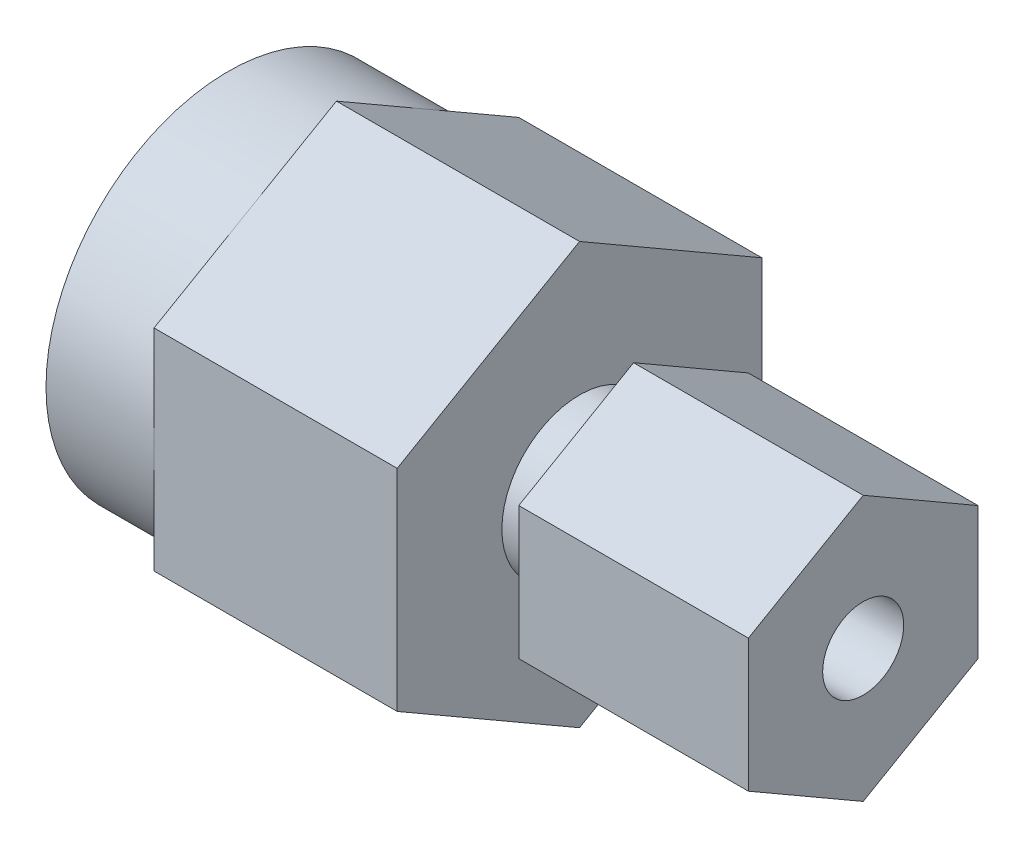
ISO-10303-21;
HEADER;
FILE_DESCRIPTION(('STEP AP214'),'2;1');
FILE_NAME('part.step','',(''),(''),'','','');
FILE_SCHEMA(('AUTOMOTIVE_DESIGN { 1 0 10303 214 1 1 1 1 }'));
ENDSEC;
DATA;
#1=APPLICATION_CONTEXT('core data for automotive mechanical design processes');
#2=APPLICATION_PROTOCOL_DEFINITION('international standard','automotive_design',2000,#1);
#3=PRODUCT_CONTEXT('',#1,'mechanical');
#4=PRODUCT('Part','Part','',(#3));
#5=PRODUCT_RELATED_PRODUCT_CATEGORY('part','',(#4));
#6=PRODUCT_DEFINITION_FORMATION('','',#4);
#7=PRODUCT_DEFINITION_CONTEXT('part definition',#1,'design');
#8=PRODUCT_DEFINITION('design','',#6,#7);
#9=PRODUCT_DEFINITION_SHAPE('','',#8);
#10=(LENGTH_UNIT() NAMED_UNIT(*) SI_UNIT(.MILLI.,.METRE.));
#11=(NAMED_UNIT(*) PLANE_ANGLE_UNIT() SI_UNIT($,.RADIAN.));
#12=(NAMED_UNIT(*) SI_UNIT($,.STERADIAN.) SOLID_ANGLE_UNIT());
#13=UNCERTAINTY_MEASURE_WITH_UNIT(LENGTH_MEASURE(1.E-05),#10,'distance_accuracy_value','');
#14=(GEOMETRIC_REPRESENTATION_CONTEXT(3) GLOBAL_UNCERTAINTY_ASSIGNED_CONTEXT((#13)) GLOBAL_UNIT_ASSIGNED_CONTEXT((#10,
#11,#12)) REPRESENTATION_CONTEXT('',''));
#15=CARTESIAN_POINT('',(0.,0.,0.));
#16=DIRECTION('',(0.,0.,1.));
#17=DIRECTION('',(1.,0.,0.));
#18=AXIS2_PLACEMENT_3D('',#15,#16,#17);
#19=CARTESIAN_POINT('',(0.,0.,0.));
#20=DIRECTION('',(-1.,0.,0.));
#21=DIRECTION('',(0.,0.,1.));
#22=AXIS2_PLACEMENT_3D('',#19,#20,#21);
#23=CYLINDRICAL_SURFACE('',#22,13.5);
#24=CARTESIAN_POINT('',(0.,0.,0.));
#25=DIRECTION('',(-1.,0.,0.));
#26=DIRECTION('',(0.,0.,1.));
#27=AXIS2_PLACEMENT_3D('',#24,#25,#26);
#28=CIRCLE('',#27,13.5);
#29=CARTESIAN_POINT('',(0.,0.,13.5));
#30=VERTEX_POINT('',#29);
#31=EDGE_CURVE('E335',#30,#30,#28,.T.);
#32=ORIENTED_EDGE('',*,*,#31,.F.);
#33=EDGE_LOOP('',(#32));
#34=FACE_BOUND('',#33,.T.);
#35=CARTESIAN_POINT('',(8.,0.,0.));
#36=DIRECTION('',(1.,0.,0.));
#37=DIRECTION('',(0.,0.,-1.));
#38=AXIS2_PLACEMENT_3D('',#35,#36,#37);
#39=CIRCLE('',#38,13.5);
#40=CARTESIAN_POINT('',(8.,0.,-13.5));
#41=VERTEX_POINT('',#40);
#42=CARTESIAN_POINT('',(8.,11.6913429510899,-6.75));
#43=VERTEX_POINT('',#42);
#44=EDGE_CURVE('E11',#41,#43,#39,.T.);
#45=ORIENTED_EDGE('',*,*,#44,.F.);
#46=CARTESIAN_POINT('',(8.,-11.6913429510899,-6.75));
#47=VERTEX_POINT('',#46);
#48=EDGE_CURVE('E49',#47,#41,#39,.T.);
#49=ORIENTED_EDGE('',*,*,#48,.F.);
#50=CARTESIAN_POINT('',(8.,-11.6913429510899,6.75));
#51=VERTEX_POINT('',#50);
#52=EDGE_CURVE('E345',#51,#47,#39,.T.);
#53=ORIENTED_EDGE('',*,*,#52,.F.);
#54=CARTESIAN_POINT('',(8.,0.,13.5));
#55=VERTEX_POINT('',#54);
#56=EDGE_CURVE('E352',#55,#51,#39,.T.);
#57=ORIENTED_EDGE('',*,*,#56,.F.);
#58=CARTESIAN_POINT('',(8.,11.6913429510899,6.75));
#59=VERTEX_POINT('',#58);
#60=EDGE_CURVE('E65',#59,#55,#39,.T.);
#61=ORIENTED_EDGE('',*,*,#60,.F.);
#62=EDGE_CURVE('E55',#43,#59,#39,.T.);
#63=ORIENTED_EDGE('',*,*,#62,.F.);
#64=EDGE_LOOP('',(#45,#49,#53,#57,#61,#63));
#65=FACE_BOUND('',#64,.T.);
#66=ADVANCED_FACE('F45',(#34,#65),#23,.T.);
#67=CARTESIAN_POINT('',(30.,5.75,0.));
#68=DIRECTION('',(1.,0.,0.));
#69=DIRECTION('',(0.,0.,-1.));
#70=AXIS2_PLACEMENT_3D('',#67,#68,#69);
#71=PLANE('',#70);
#72=CARTESIAN_POINT('',(30.,0.,0.));
#73=DIRECTION('',(-1.,0.,0.));
#74=DIRECTION('',(0.,0.,1.));
#75=AXIS2_PLACEMENT_3D('',#72,#73,#74);
#76=CIRCLE('',#75,5.75);
#77=CARTESIAN_POINT('',(30.,0.,5.75));
#78=VERTEX_POINT('',#77);
#79=EDGE_CURVE('E327',#78,#78,#76,.T.);
#80=ORIENTED_EDGE('',*,*,#79,.F.);
#81=EDGE_LOOP('',(#80));
#82=FACE_BOUND('',#81,.T.);
#83=DIRECTION('',(0.,0.5,0.866025403784439));
#84=VECTOR('',#83,1.);
#85=CARTESIAN_POINT('',(30.,8.79871593216773,-1.76017696411974));
#86=LINE('',#85,#84);
#87=CARTESIAN_POINT('',(30.,4.90747728811182,-8.5));
#88=VERTEX_POINT('',#87);
#89=CARTESIAN_POINT('',(30.,9.81495457622364,0.));
#90=VERTEX_POINT('',#89);
#91=EDGE_CURVE('E295',#88,#90,#86,.T.);
#92=ORIENTED_EDGE('',*,*,#91,.F.);
#93=DIRECTION('',(0.,1.,0.));
#94=VECTOR('',#93,1.);
#95=CARTESIAN_POINT('',(30.,5.75,-8.5));
#96=LINE('',#95,#94);
#97=CARTESIAN_POINT('',(30.,-4.90747728811182,-8.5));
#98=VERTEX_POINT('',#97);
#99=EDGE_CURVE('E292',#98,#88,#96,.T.);
#100=ORIENTED_EDGE('',*,*,#99,.F.);
#101=DIRECTION('',(0.,0.5,-0.866025403784439));
#102=VECTOR('',#101,1.);
#103=CARTESIAN_POINT('',(30.,-5.92371593216773,-6.73982303588026));
#104=LINE('',#103,#102);
#105=CARTESIAN_POINT('',(30.,-9.81495457622364,0.));
#106=VERTEX_POINT('',#105);
#107=EDGE_CURVE('E289',#106,#98,#104,.T.);
#108=ORIENTED_EDGE('',*,*,#107,.F.);
#109=DIRECTION('',(0.,-0.5,-0.866025403784439));
#110=VECTOR('',#109,1.);
#111=CARTESIAN_POINT('',(30.,-5.92371593216773,6.73982303588027));
#112=LINE('',#111,#110);
#113=CARTESIAN_POINT('',(30.,-4.90747728811182,8.5));
#114=VERTEX_POINT('',#113);
#115=EDGE_CURVE('E286',#114,#106,#112,.T.);
#116=ORIENTED_EDGE('',*,*,#115,.F.);
#117=DIRECTION('',(0.,-1.,0.));
#118=VECTOR('',#117,1.);
#119=CARTESIAN_POINT('',(30.,5.75,8.5));
#120=LINE('',#119,#118);
#121=CARTESIAN_POINT('',(30.,4.90747728811182,8.5));
#122=VERTEX_POINT('',#121);
#123=EDGE_CURVE('E283',#122,#114,#120,.T.);
#124=ORIENTED_EDGE('',*,*,#123,.F.);
#125=DIRECTION('',(0.,-0.5,0.866025403784439));
#126=VECTOR('',#125,1.);
#127=CARTESIAN_POINT('',(30.,8.79871593216773,1.76017696411974));
#128=LINE('',#127,#126);
#129=EDGE_CURVE('E265',#90,#122,#128,.T.);
#130=ORIENTED_EDGE('',*,*,#129,.F.);
#131=EDGE_LOOP('',(#92,#100,#108,#116,#124,#130));
#132=FACE_BOUND('',#131,.T.);
#133=ADVANCED_FACE('F381',(#82,#132),#71,.F.);
#134=CARTESIAN_POINT('',(47.,10.,0.));
#135=DIRECTION('',(-1.,0.,0.));
#136=DIRECTION('',(0.,0.,1.));
#137=AXIS2_PLACEMENT_3D('',#134,#135,#136);
#138=PLANE('',#137);
#139=CARTESIAN_POINT('',(47.,0.,0.));
#140=DIRECTION('',(-1.,0.,0.));
#141=DIRECTION('',(0.,0.,1.));
#142=AXIS2_PLACEMENT_3D('',#139,#140,#141);
#143=CIRCLE('',#142,3.);
#144=CARTESIAN_POINT('',(47.,0.,3.));
#145=VERTEX_POINT('',#144);
#146=EDGE_CURVE('E323',#145,#145,#143,.T.);
#147=ORIENTED_EDGE('',*,*,#146,.T.);
#148=EDGE_LOOP('',(#147));
#149=FACE_BOUND('',#148,.T.);
#150=DIRECTION('',(0.,0.5,0.866025403784438));
#151=VECTOR('',#150,1.);
#152=CARTESIAN_POINT('',(47.,4.90747728811182,-8.5));
#153=LINE('',#152,#151);
#154=CARTESIAN_POINT('',(47.,4.90747728811182,-8.5));
#155=VERTEX_POINT('',#154);
#156=CARTESIAN_POINT('',(47.,9.81495457622364,0.));
#157=VERTEX_POINT('',#156);
#158=EDGE_CURVE('E223',#155,#157,#153,.T.);
#159=ORIENTED_EDGE('',*,*,#158,.T.);
#160=DIRECTION('',(0.,-0.5,0.866025403784439));
#161=VECTOR('',#160,1.);
#162=CARTESIAN_POINT('',(47.,9.81495457622364,0.));
#163=LINE('',#162,#161);
#164=CARTESIAN_POINT('',(47.,4.90747728811182,8.5));
#165=VERTEX_POINT('',#164);
#166=EDGE_CURVE('E241',#157,#165,#163,.T.);
#167=ORIENTED_EDGE('',*,*,#166,.T.);
#168=DIRECTION('',(0.,-1.,0.));
#169=VECTOR('',#168,1.);
#170=CARTESIAN_POINT('',(47.,4.90747728811182,8.5));
#171=LINE('',#170,#169);
#172=CARTESIAN_POINT('',(47.,-4.90747728811182,8.5));
#173=VERTEX_POINT('',#172);
#174=EDGE_CURVE('E245',#165,#173,#171,.T.);
#175=ORIENTED_EDGE('',*,*,#174,.T.);
#176=DIRECTION('',(0.,-0.5,-0.866025403784439));
#177=VECTOR('',#176,1.);
#178=CARTESIAN_POINT('',(47.,-4.90747728811182,8.5));
#179=LINE('',#178,#177);
#180=CARTESIAN_POINT('',(47.,-9.81495457622364,0.));
#181=VERTEX_POINT('',#180);
#182=EDGE_CURVE('E249',#173,#181,#179,.T.);
#183=ORIENTED_EDGE('',*,*,#182,.T.);
#184=DIRECTION('',(0.,0.5,-0.866025403784439));
#185=VECTOR('',#184,1.);
#186=CARTESIAN_POINT('',(47.,-9.81495457622364,0.));
#187=LINE('',#186,#185);
#188=CARTESIAN_POINT('',(47.,-4.90747728811182,-8.5));
#189=VERTEX_POINT('',#188);
#190=EDGE_CURVE('E253',#181,#189,#187,.T.);
#191=ORIENTED_EDGE('',*,*,#190,.T.);
#192=DIRECTION('',(0.,1.,0.));
#193=VECTOR('',#192,1.);
#194=CARTESIAN_POINT('',(47.,-4.90747728811182,-8.5));
#195=LINE('',#194,#193);
#196=EDGE_CURVE('E257',#189,#155,#195,.T.);
#197=ORIENTED_EDGE('',*,*,#196,.T.);
#198=EDGE_LOOP('',(#159,#167,#175,#183,#191,#197));
#199=FACE_BOUND('',#198,.T.);
#200=ADVANCED_FACE('F389',(#149,#199),#138,.F.);
#201=CARTESIAN_POINT('',(0.,0.,0.));
#202=DIRECTION('',(-1.,0.,0.));
#203=DIRECTION('',(0.,0.,1.));
#204=AXIS2_PLACEMENT_3D('',#201,#202,#203);
#205=CYLINDRICAL_SURFACE('',#204,9.5);
#206=CARTESIAN_POINT('',(20.,0.,0.));
#207=DIRECTION('',(-1.,0.,0.));
#208=DIRECTION('',(0.,0.,1.));
#209=AXIS2_PLACEMENT_3D('',#206,#207,#208);
#210=CIRCLE('',#209,9.5);
#211=CARTESIAN_POINT('',(20.,0.,9.5));
#212=VERTEX_POINT('',#211);
#213=EDGE_CURVE('E299',#212,#212,#210,.T.);
#214=ORIENTED_EDGE('',*,*,#213,.F.);
#215=EDGE_LOOP('',(#214));
#216=FACE_BOUND('',#215,.T.);
#217=CARTESIAN_POINT('',(0.,0.,0.));
#218=DIRECTION('',(-1.,0.,0.));
#219=DIRECTION('',(0.,0.,1.));
#220=AXIS2_PLACEMENT_3D('',#217,#218,#219);
#221=CIRCLE('',#220,9.5);
#222=CARTESIAN_POINT('',(0.,0.,9.5));
#223=VERTEX_POINT('',#222);
#224=EDGE_CURVE('E338',#223,#223,#221,.T.);
#225=ORIENTED_EDGE('',*,*,#224,.T.);
#226=EDGE_LOOP('',(#225));
#227=FACE_BOUND('',#226,.T.);
#228=ADVANCED_FACE('F47',(#216,#227),#205,.F.);
#229=CARTESIAN_POINT('',(0.,9.5,0.));
#230=DIRECTION('',(1.,0.,0.));
#231=DIRECTION('',(0.,0.,-1.));
#232=AXIS2_PLACEMENT_3D('',#229,#230,#231);
#233=PLANE('',#232);
#234=ORIENTED_EDGE('',*,*,#224,.F.);
#235=EDGE_LOOP('',(#234));
#236=FACE_BOUND('',#235,.T.);
#237=ORIENTED_EDGE('',*,*,#31,.T.);
#238=EDGE_LOOP('',(#237));
#239=FACE_BOUND('',#238,.T.);
#240=ADVANCED_FACE('F395',(#236,#239),#233,.F.);
#241=CARTESIAN_POINT('',(26.,13.5,0.));
#242=DIRECTION('',(-1.,0.,0.));
#243=DIRECTION('',(0.,0.,1.));
#244=AXIS2_PLACEMENT_3D('',#241,#242,#243);
#245=PLANE('',#244);
#246=DIRECTION('',(0.,0.5,-0.866025403784439));
#247=VECTOR('',#246,1.);
#248=CARTESIAN_POINT('',(26.,-15.5884572681199,0.));
#249=LINE('',#248,#247);
#250=CARTESIAN_POINT('',(26.,-15.5884572681199,0.));
#251=VERTEX_POINT('',#250);
#252=CARTESIAN_POINT('',(26.,-7.79422863405996,-13.5));
#253=VERTEX_POINT('',#252);
#254=EDGE_CURVE('E213',#251,#253,#249,.T.);
#255=ORIENTED_EDGE('',*,*,#254,.T.);
#256=DIRECTION('',(0.,1.,0.));
#257=VECTOR('',#256,1.);
#258=CARTESIAN_POINT('',(26.,-7.79422863405996,-13.5));
#259=LINE('',#258,#257);
#260=CARTESIAN_POINT('',(26.,7.79422863405996,-13.5));
#261=VERTEX_POINT('',#260);
#262=EDGE_CURVE('E163',#253,#261,#259,.T.);
#263=ORIENTED_EDGE('',*,*,#262,.T.);
#264=DIRECTION('',(0.,0.5,0.866025403784438));
#265=VECTOR('',#264,1.);
#266=CARTESIAN_POINT('',(26.,7.79422863405996,-13.5));
#267=LINE('',#266,#265);
#268=CARTESIAN_POINT('',(26.,15.5884572681199,0.));
#269=VERTEX_POINT('',#268);
#270=EDGE_CURVE('E202',#261,#269,#267,.T.);
#271=ORIENTED_EDGE('',*,*,#270,.T.);
#272=DIRECTION('',(0.,-0.5,0.866025403784439));
#273=VECTOR('',#272,1.);
#274=CARTESIAN_POINT('',(26.,15.5884572681199,0.));
#275=LINE('',#274,#273);
#276=CARTESIAN_POINT('',(26.,7.79422863405995,13.5));
#277=VERTEX_POINT('',#276);
#278=EDGE_CURVE('E170',#269,#277,#275,.T.);
#279=ORIENTED_EDGE('',*,*,#278,.T.);
#280=DIRECTION('',(0.,-1.,0.));
#281=VECTOR('',#280,1.);
#282=CARTESIAN_POINT('',(26.,7.79422863405995,13.5));
#283=LINE('',#282,#281);
#284=CARTESIAN_POINT('',(26.,-7.79422863405995,13.5));
#285=VERTEX_POINT('',#284);
#286=EDGE_CURVE('E207',#277,#285,#283,.T.);
#287=ORIENTED_EDGE('',*,*,#286,.T.);
#288=DIRECTION('',(0.,-0.5,-0.866025403784438));
#289=VECTOR('',#288,1.);
#290=CARTESIAN_POINT('',(26.,-7.79422863405995,13.5));
#291=LINE('',#290,#289);
#292=EDGE_CURVE('E210',#285,#251,#291,.T.);
#293=ORIENTED_EDGE('',*,*,#292,.T.);
#294=EDGE_LOOP('',(#255,#263,#271,#279,#287,#293));
#295=FACE_BOUND('',#294,.T.);
#296=CARTESIAN_POINT('',(26.,0.,0.));
#297=DIRECTION('',(-1.,0.,0.));
#298=DIRECTION('',(0.,0.,1.));
#299=AXIS2_PLACEMENT_3D('',#296,#297,#298);
#300=CIRCLE('',#299,5.75);
#301=CARTESIAN_POINT('',(26.,0.,5.75));
#302=VERTEX_POINT('',#301);
#303=EDGE_CURVE('E331',#302,#302,#300,.T.);
#304=ORIENTED_EDGE('',*,*,#303,.T.);
#305=EDGE_LOOP('',(#304));
#306=FACE_BOUND('',#305,.T.);
#307=ADVANCED_FACE('F374',(#295,#306),#245,.F.);
#308=CARTESIAN_POINT('',(0.,0.,0.));
#309=DIRECTION('',(-1.,0.,0.));
#310=DIRECTION('',(0.,0.,1.));
#311=AXIS2_PLACEMENT_3D('',#308,#309,#310);
#312=CYLINDRICAL_SURFACE('',#311,5.75);
#313=ORIENTED_EDGE('',*,*,#303,.F.);
#314=EDGE_LOOP('',(#313));
#315=FACE_BOUND('',#314,.T.);
#316=ORIENTED_EDGE('',*,*,#79,.T.);
#317=EDGE_LOOP('',(#316));
#318=FACE_BOUND('',#317,.T.);
#319=ADVANCED_FACE('F402',(#315,#318),#312,.T.);
#320=CARTESIAN_POINT('',(0.,0.,0.));
#321=DIRECTION('',(-1.,0.,0.));
#322=DIRECTION('',(0.,0.,1.));
#323=AXIS2_PLACEMENT_3D('',#320,#321,#322);
#324=CYLINDRICAL_SURFACE('',#323,3.);
#325=ORIENTED_EDGE('',*,*,#146,.F.);
#326=EDGE_LOOP('',(#325));
#327=FACE_BOUND('',#326,.T.);
#328=CARTESIAN_POINT('',(30.5,0.,0.));
#329=DIRECTION('',(-1.,0.,0.));
#330=DIRECTION('',(0.,0.,1.));
#331=AXIS2_PLACEMENT_3D('',#328,#329,#330);
#332=CIRCLE('',#331,3.);
#333=CARTESIAN_POINT('',(30.5,0.,3.));
#334=VERTEX_POINT('',#333);
#335=EDGE_CURVE('E319',#334,#334,#332,.T.);
#336=ORIENTED_EDGE('',*,*,#335,.T.);
#337=EDGE_LOOP('',(#336));
#338=FACE_BOUND('',#337,.T.);
#339=ADVANCED_FACE('F441',(#327,#338),#324,.F.);
#340=CARTESIAN_POINT('',(30.5,3.,0.));
#341=DIRECTION('',(-1.,0.,0.));
#342=DIRECTION('',(0.,0.,1.));
#343=AXIS2_PLACEMENT_3D('',#340,#341,#342);
#344=PLANE('',#343);
#345=ORIENTED_EDGE('',*,*,#335,.F.);
#346=EDGE_LOOP('',(#345));
#347=FACE_BOUND('',#346,.T.);
#348=CARTESIAN_POINT('',(30.5,0.,0.));
#349=DIRECTION('',(-1.,0.,0.));
#350=DIRECTION('',(0.,0.,1.));
#351=AXIS2_PLACEMENT_3D('',#348,#349,#350);
#352=CIRCLE('',#351,2.);
#353=CARTESIAN_POINT('',(30.5,0.,2.));
#354=VERTEX_POINT('',#353);
#355=EDGE_CURVE('E315',#354,#354,#352,.T.);
#356=ORIENTED_EDGE('',*,*,#355,.T.);
#357=EDGE_LOOP('',(#356));
#358=FACE_BOUND('',#357,.T.);
#359=ADVANCED_FACE('F437',(#347,#358),#344,.F.);
#360=CARTESIAN_POINT('',(0.,0.,0.));
#361=DIRECTION('',(-1.,0.,0.));
#362=DIRECTION('',(0.,0.,1.));
#363=AXIS2_PLACEMENT_3D('',#360,#361,#362);
#364=CYLINDRICAL_SURFACE('',#363,2.);
#365=ORIENTED_EDGE('',*,*,#355,.F.);
#366=EDGE_LOOP('',(#365));
#367=FACE_BOUND('',#366,.T.);
#368=CARTESIAN_POINT('',(23.,0.,0.));
#369=DIRECTION('',(-1.,0.,0.));
#370=DIRECTION('',(0.,0.,1.));
#371=AXIS2_PLACEMENT_3D('',#368,#369,#370);
#372=CIRCLE('',#371,2.);
#373=CARTESIAN_POINT('',(23.,0.,2.));
#374=VERTEX_POINT('',#373);
#375=EDGE_CURVE('E311',#374,#374,#372,.T.);
#376=ORIENTED_EDGE('',*,*,#375,.T.);
#377=EDGE_LOOP('',(#376));
#378=FACE_BOUND('',#377,.T.);
#379=ADVANCED_FACE('F433',(#367,#378),#364,.F.);
#380=CARTESIAN_POINT('',(23.,2.,0.));
#381=DIRECTION('',(1.,0.,0.));
#382=DIRECTION('',(0.,0.,-1.));
#383=AXIS2_PLACEMENT_3D('',#380,#381,#382);
#384=PLANE('',#383);
#385=ORIENTED_EDGE('',*,*,#375,.F.);
#386=EDGE_LOOP('',(#385));
#387=FACE_BOUND('',#386,.T.);
#388=CARTESIAN_POINT('',(23.,0.,0.));
#389=DIRECTION('',(-1.,0.,0.));
#390=DIRECTION('',(0.,0.,1.));
#391=AXIS2_PLACEMENT_3D('',#388,#389,#390);
#392=CIRCLE('',#391,3.);
#393=CARTESIAN_POINT('',(23.,0.,3.));
#394=VERTEX_POINT('',#393);
#395=EDGE_CURVE('E307',#394,#394,#392,.T.);
#396=ORIENTED_EDGE('',*,*,#395,.T.);
#397=EDGE_LOOP('',(#396));
#398=FACE_BOUND('',#397,.T.);
#399=ADVANCED_FACE('F425',(#387,#398),#384,.F.);
#400=CARTESIAN_POINT('',(0.,0.,0.));
#401=DIRECTION('',(-1.,0.,0.));
#402=DIRECTION('',(0.,0.,1.));
#403=AXIS2_PLACEMENT_3D('',#400,#401,#402);
#404=CYLINDRICAL_SURFACE('',#403,3.);
#405=ORIENTED_EDGE('',*,*,#395,.F.);
#406=EDGE_LOOP('',(#405));
#407=FACE_BOUND('',#406,.T.);
#408=CARTESIAN_POINT('',(20.,0.,0.));
#409=DIRECTION('',(-1.,0.,0.));
#410=DIRECTION('',(0.,0.,1.));
#411=AXIS2_PLACEMENT_3D('',#408,#409,#410);
#412=CIRCLE('',#411,3.);
#413=CARTESIAN_POINT('',(20.,0.,3.));
#414=VERTEX_POINT('',#413);
#415=EDGE_CURVE('E303',#414,#414,#412,.T.);
#416=ORIENTED_EDGE('',*,*,#415,.T.);
#417=EDGE_LOOP('',(#416));
#418=FACE_BOUND('',#417,.T.);
#419=ADVANCED_FACE('F415',(#407,#418),#404,.F.);
#420=CARTESIAN_POINT('',(20.,3.,0.));
#421=DIRECTION('',(1.,0.,0.));
#422=DIRECTION('',(0.,0.,-1.));
#423=AXIS2_PLACEMENT_3D('',#420,#421,#422);
#424=PLANE('',#423);
#425=ORIENTED_EDGE('',*,*,#415,.F.);
#426=EDGE_LOOP('',(#425));
#427=FACE_BOUND('',#426,.T.);
#428=ORIENTED_EDGE('',*,*,#213,.T.);
#429=EDGE_LOOP('',(#428));
#430=FACE_BOUND('',#429,.T.);
#431=ADVANCED_FACE('F412',(#427,#430),#424,.F.);
#432=CARTESIAN_POINT('',(29.,4.90747728811182,-8.5));
#433=DIRECTION('',(0.,0.866025403784439,-0.5));
#434=DIRECTION('',(0.,0.5,0.866025403784439));
#435=AXIS2_PLACEMENT_3D('',#432,#433,#434);
#436=PLANE('',#435);
#437=ORIENTED_EDGE('',*,*,#91,.T.);
#438=DIRECTION('',(1.,0.,0.));
#439=VECTOR('',#438,1.);
#440=CARTESIAN_POINT('',(29.,9.81495457622364,0.));
#441=LINE('',#440,#439);
#442=EDGE_CURVE('E261',#90,#157,#441,.T.);
#443=ORIENTED_EDGE('',*,*,#442,.T.);
#444=ORIENTED_EDGE('',*,*,#158,.F.);
#445=DIRECTION('',(1.,0.,0.));
#446=VECTOR('',#445,1.);
#447=CARTESIAN_POINT('',(29.,4.90747728811182,-8.5));
#448=LINE('',#447,#446);
#449=EDGE_CURVE('E262',#88,#155,#448,.T.);
#450=ORIENTED_EDGE('',*,*,#449,.F.);
#451=EDGE_LOOP('',(#437,#443,#444,#450));
#452=FACE_BOUND('',#451,.T.);
#453=ADVANCED_FACE('F414',(#452),#436,.T.);
#454=CARTESIAN_POINT('',(29.,-4.90747728811182,-8.5));
#455=DIRECTION('',(0.,0.,-1.));
#456=DIRECTION('',(0.,1.,0.));
#457=AXIS2_PLACEMENT_3D('',#454,#455,#456);
#458=PLANE('',#457);
#459=ORIENTED_EDGE('',*,*,#99,.T.);
#460=ORIENTED_EDGE('',*,*,#449,.T.);
#461=ORIENTED_EDGE('',*,*,#196,.F.);
#462=DIRECTION('',(1.,0.,0.));
#463=VECTOR('',#462,1.);
#464=CARTESIAN_POINT('',(29.,-4.90747728811182,-8.5));
#465=LINE('',#464,#463);
#466=EDGE_CURVE('E266',#98,#189,#465,.T.);
#467=ORIENTED_EDGE('',*,*,#466,.F.);
#468=EDGE_LOOP('',(#459,#460,#461,#467));
#469=FACE_BOUND('',#468,.T.);
#470=ADVANCED_FACE('F422',(#469),#458,.T.);
#471=CARTESIAN_POINT('',(29.,-9.81495457622364,0.));
#472=DIRECTION('',(0.,-0.866025403784439,-0.5));
#473=DIRECTION('',(0.,0.5,-0.866025403784439));
#474=AXIS2_PLACEMENT_3D('',#471,#472,#473);
#475=PLANE('',#474);
#476=ORIENTED_EDGE('',*,*,#107,.T.);
#477=ORIENTED_EDGE('',*,*,#466,.T.);
#478=ORIENTED_EDGE('',*,*,#190,.F.);
#479=DIRECTION('',(1.,0.,0.));
#480=VECTOR('',#479,1.);
#481=CARTESIAN_POINT('',(29.,-9.81495457622364,0.));
#482=LINE('',#481,#480);
#483=EDGE_CURVE('E269',#106,#181,#482,.T.);
#484=ORIENTED_EDGE('',*,*,#483,.F.);
#485=EDGE_LOOP('',(#476,#477,#478,#484));
#486=FACE_BOUND('',#485,.T.);
#487=ADVANCED_FACE('F465',(#486),#475,.T.);
#488=CARTESIAN_POINT('',(29.,-4.90747728811182,8.5));
#489=DIRECTION('',(0.,-0.866025403784439,0.5));
#490=DIRECTION('',(0.,-0.5,-0.866025403784439));
#491=AXIS2_PLACEMENT_3D('',#488,#489,#490);
#492=PLANE('',#491);
#493=ORIENTED_EDGE('',*,*,#115,.T.);
#494=ORIENTED_EDGE('',*,*,#483,.T.);
#495=ORIENTED_EDGE('',*,*,#182,.F.);
#496=DIRECTION('',(1.,0.,0.));
#497=VECTOR('',#496,1.);
#498=CARTESIAN_POINT('',(29.,-4.90747728811182,8.5));
#499=LINE('',#498,#497);
#500=EDGE_CURVE('E272',#114,#173,#499,.T.);
#501=ORIENTED_EDGE('',*,*,#500,.F.);
#502=EDGE_LOOP('',(#493,#494,#495,#501));
#503=FACE_BOUND('',#502,.T.);
#504=ADVANCED_FACE('F470',(#503),#492,.T.);
#505=CARTESIAN_POINT('',(29.,4.90747728811182,8.5));
#506=DIRECTION('',(0.,0.,1.));
#507=DIRECTION('',(1.,0.,0.));
#508=AXIS2_PLACEMENT_3D('',#505,#506,#507);
#509=PLANE('',#508);
#510=ORIENTED_EDGE('',*,*,#123,.T.);
#511=ORIENTED_EDGE('',*,*,#500,.T.);
#512=ORIENTED_EDGE('',*,*,#174,.F.);
#513=DIRECTION('',(1.,0.,0.));
#514=VECTOR('',#513,1.);
#515=CARTESIAN_POINT('',(29.,4.90747728811182,8.5));
#516=LINE('',#515,#514);
#517=EDGE_CURVE('E275',#122,#165,#516,.T.);
#518=ORIENTED_EDGE('',*,*,#517,.F.);
#519=EDGE_LOOP('',(#510,#511,#512,#518));
#520=FACE_BOUND('',#519,.T.);
#521=ADVANCED_FACE('F473',(#520),#509,.T.);
#522=CARTESIAN_POINT('',(29.,9.81495457622364,0.));
#523=DIRECTION('',(0.,0.866025403784439,0.5));
#524=DIRECTION('',(0.,-0.5,0.866025403784439));
#525=AXIS2_PLACEMENT_3D('',#522,#523,#524);
#526=PLANE('',#525);
#527=ORIENTED_EDGE('',*,*,#129,.T.);
#528=ORIENTED_EDGE('',*,*,#517,.T.);
#529=ORIENTED_EDGE('',*,*,#166,.F.);
#530=ORIENTED_EDGE('',*,*,#442,.F.);
#531=EDGE_LOOP('',(#527,#528,#529,#530));
#532=FACE_BOUND('',#531,.T.);
#533=ADVANCED_FACE('F476',(#532),#526,.T.);
#534=CARTESIAN_POINT('',(8.,0.,0.));
#535=DIRECTION('',(1.,0.,0.));
#536=DIRECTION('',(0.,0.,-1.));
#537=AXIS2_PLACEMENT_3D('',#534,#535,#536);
#538=PLANE('',#537);
#539=DIRECTION('',(0.,1.,0.));
#540=VECTOR('',#539,1.);
#541=CARTESIAN_POINT('',(8.,-7.79422863405996,-13.5));
#542=LINE('',#541,#540);
#543=CARTESIAN_POINT('',(8.,7.79422863405996,-13.5));
#544=VERTEX_POINT('',#543);
#545=EDGE_CURVE('E198',#41,#544,#542,.T.);
#546=ORIENTED_EDGE('',*,*,#545,.F.);
#547=ORIENTED_EDGE('',*,*,#44,.T.);
#548=DIRECTION('',(0.,0.5,0.866025403784438));
#549=VECTOR('',#548,1.);
#550=CARTESIAN_POINT('',(8.,7.79422863405996,-13.5));
#551=LINE('',#550,#549);
#552=EDGE_CURVE('E159',#544,#43,#551,.T.);
#553=ORIENTED_EDGE('',*,*,#552,.F.);
#554=EDGE_LOOP('',(#546,#547,#553));
#555=FACE_BOUND('',#554,.T.);
#556=ADVANCED_FACE('F378',(#555),#538,.F.);
#557=CARTESIAN_POINT('',(8.,15.5884572681199,0.));
#558=VERTEX_POINT('',#557);
#559=EDGE_CURVE('E151',#43,#558,#551,.T.);
#560=ORIENTED_EDGE('',*,*,#559,.F.);
#561=ORIENTED_EDGE('',*,*,#62,.T.);
#562=DIRECTION('',(0.,-0.5,0.866025403784439));
#563=VECTOR('',#562,1.);
#564=CARTESIAN_POINT('',(8.,15.5884572681199,0.));
#565=LINE('',#564,#563);
#566=EDGE_CURVE('E168',#558,#59,#565,.T.);
#567=ORIENTED_EDGE('',*,*,#566,.F.);
#568=EDGE_LOOP('',(#560,#561,#567));
#569=FACE_BOUND('',#568,.T.);
#570=ADVANCED_FACE('F175',(#569),#538,.F.);
#571=CARTESIAN_POINT('',(8.,7.79422863405995,13.5));
#572=VERTEX_POINT('',#571);
#573=EDGE_CURVE('E179',#59,#572,#565,.T.);
#574=ORIENTED_EDGE('',*,*,#573,.F.);
#575=ORIENTED_EDGE('',*,*,#60,.T.);
#576=DIRECTION('',(0.,-1.,0.));
#577=VECTOR('',#576,1.);
#578=CARTESIAN_POINT('',(8.,7.79422863405995,13.5));
#579=LINE('',#578,#577);
#580=EDGE_CURVE('E183',#572,#55,#579,.T.);
#581=ORIENTED_EDGE('',*,*,#580,.F.);
#582=EDGE_LOOP('',(#574,#575,#581));
#583=FACE_BOUND('',#582,.T.);
#584=ADVANCED_FACE('F365',(#583),#538,.F.);
#585=CARTESIAN_POINT('',(8.,-7.79422863405995,13.5));
#586=VERTEX_POINT('',#585);
#587=EDGE_CURVE('E178',#55,#586,#579,.T.);
#588=ORIENTED_EDGE('',*,*,#587,.F.);
#589=ORIENTED_EDGE('',*,*,#56,.T.);
#590=DIRECTION('',(0.,-0.5,-0.866025403784438));
#591=VECTOR('',#590,1.);
#592=CARTESIAN_POINT('',(8.,-7.79422863405995,13.5));
#593=LINE('',#592,#591);
#594=EDGE_CURVE('E189',#586,#51,#593,.T.);
#595=ORIENTED_EDGE('',*,*,#594,.F.);
#596=EDGE_LOOP('',(#588,#589,#595));
#597=FACE_BOUND('',#596,.T.);
#598=ADVANCED_FACE('F366',(#597),#538,.F.);
#599=CARTESIAN_POINT('',(8.,-15.5884572681199,0.));
#600=VERTEX_POINT('',#599);
#601=EDGE_CURVE('E188',#51,#600,#593,.T.);
#602=ORIENTED_EDGE('',*,*,#601,.F.);
#603=ORIENTED_EDGE('',*,*,#52,.T.);
#604=DIRECTION('',(0.,0.5,-0.866025403784439));
#605=VECTOR('',#604,1.);
#606=CARTESIAN_POINT('',(8.,-15.5884572681199,0.));
#607=LINE('',#606,#605);
#608=EDGE_CURVE('E194',#600,#47,#607,.T.);
#609=ORIENTED_EDGE('',*,*,#608,.F.);
#610=EDGE_LOOP('',(#602,#603,#609));
#611=FACE_BOUND('',#610,.T.);
#612=ADVANCED_FACE('F495',(#611),#538,.F.);
#613=CARTESIAN_POINT('',(8.,7.79422863405996,-13.5));
#614=DIRECTION('',(0.,0.866025403784438,-0.5));
#615=DIRECTION('',(0.,0.5,0.866025403784439));
#616=AXIS2_PLACEMENT_3D('',#613,#614,#615);
#617=PLANE('',#616);
#618=ORIENTED_EDGE('',*,*,#552,.T.);
#619=ORIENTED_EDGE('',*,*,#559,.T.);
#620=DIRECTION('',(1.,0.,0.));
#621=VECTOR('',#620,1.);
#622=CARTESIAN_POINT('',(8.,15.5884572681199,0.));
#623=LINE('',#622,#621);
#624=EDGE_CURVE('E155',#558,#269,#623,.T.);
#625=ORIENTED_EDGE('',*,*,#624,.T.);
#626=ORIENTED_EDGE('',*,*,#270,.F.);
#627=DIRECTION('',(1.,0.,0.));
#628=VECTOR('',#627,1.);
#629=CARTESIAN_POINT('',(8.,7.79422863405996,-13.5));
#630=LINE('',#629,#628);
#631=EDGE_CURVE('E219',#544,#261,#630,.T.);
#632=ORIENTED_EDGE('',*,*,#631,.F.);
#633=EDGE_LOOP('',(#618,#619,#625,#626,#632));
#634=FACE_BOUND('',#633,.T.);
#635=ADVANCED_FACE('F153',(#634),#617,.T.);
#636=CARTESIAN_POINT('',(8.,-7.79422863405996,-13.5));
#637=DIRECTION('',(0.,0.,-1.));
#638=DIRECTION('',(0.,1.,0.));
#639=AXIS2_PLACEMENT_3D('',#636,#637,#638);
#640=PLANE('',#639);
#641=CARTESIAN_POINT('',(8.,-7.79422863405996,-13.5));
#642=VERTEX_POINT('',#641);
#643=EDGE_CURVE('E173',#642,#41,#542,.T.);
#644=ORIENTED_EDGE('',*,*,#643,.T.);
#645=ORIENTED_EDGE('',*,*,#545,.T.);
#646=ORIENTED_EDGE('',*,*,#631,.T.);
#647=ORIENTED_EDGE('',*,*,#262,.F.);
#648=DIRECTION('',(1.,0.,0.));
#649=VECTOR('',#648,1.);
#650=CARTESIAN_POINT('',(8.,-7.79422863405996,-13.5));
#651=LINE('',#650,#649);
#652=EDGE_CURVE('E224',#642,#253,#651,.T.);
#653=ORIENTED_EDGE('',*,*,#652,.F.);
#654=EDGE_LOOP('',(#644,#645,#646,#647,#653));
#655=FACE_BOUND('',#654,.T.);
#656=ADVANCED_FACE('F494',(#655),#640,.T.);
#657=CARTESIAN_POINT('',(8.,-15.5884572681199,0.));
#658=DIRECTION('',(0.,-0.866025403784439,-0.5));
#659=DIRECTION('',(0.,0.5,-0.866025403784439));
#660=AXIS2_PLACEMENT_3D('',#657,#658,#659);
#661=PLANE('',#660);
#662=ORIENTED_EDGE('',*,*,#608,.T.);
#663=EDGE_CURVE('E193',#47,#642,#607,.T.);
#664=ORIENTED_EDGE('',*,*,#663,.T.);
#665=ORIENTED_EDGE('',*,*,#652,.T.);
#666=ORIENTED_EDGE('',*,*,#254,.F.);
#667=DIRECTION('',(1.,0.,0.));
#668=VECTOR('',#667,1.);
#669=CARTESIAN_POINT('',(8.,-15.5884572681199,0.));
#670=LINE('',#669,#668);
#671=EDGE_CURVE('E228',#600,#251,#670,.T.);
#672=ORIENTED_EDGE('',*,*,#671,.F.);
#673=EDGE_LOOP('',(#662,#664,#665,#666,#672));
#674=FACE_BOUND('',#673,.T.);
#675=ADVANCED_FACE('F503',(#674),#661,.T.);
#676=CARTESIAN_POINT('',(8.,-7.79422863405995,13.5));
#677=DIRECTION('',(0.,-0.866025403784438,0.5));
#678=DIRECTION('',(0.,-0.5,-0.866025403784439));
#679=AXIS2_PLACEMENT_3D('',#676,#677,#678);
#680=PLANE('',#679);
#681=ORIENTED_EDGE('',*,*,#594,.T.);
#682=ORIENTED_EDGE('',*,*,#601,.T.);
#683=ORIENTED_EDGE('',*,*,#671,.T.);
#684=ORIENTED_EDGE('',*,*,#292,.F.);
#685=DIRECTION('',(1.,0.,0.));
#686=VECTOR('',#685,1.);
#687=CARTESIAN_POINT('',(8.,-7.79422863405995,13.5));
#688=LINE('',#687,#686);
#689=EDGE_CURVE('E232',#586,#285,#688,.T.);
#690=ORIENTED_EDGE('',*,*,#689,.F.);
#691=EDGE_LOOP('',(#681,#682,#683,#684,#690));
#692=FACE_BOUND('',#691,.T.);
#693=ADVANCED_FACE('F500',(#692),#680,.T.);
#694=CARTESIAN_POINT('',(8.,7.79422863405995,13.5));
#695=DIRECTION('',(0.,0.,1.));
#696=DIRECTION('',(1.,0.,0.));
#697=AXIS2_PLACEMENT_3D('',#694,#695,#696);
#698=PLANE('',#697);
#699=ORIENTED_EDGE('',*,*,#580,.T.);
#700=ORIENTED_EDGE('',*,*,#587,.T.);
#701=ORIENTED_EDGE('',*,*,#689,.T.);
#702=ORIENTED_EDGE('',*,*,#286,.F.);
#703=DIRECTION('',(1.,0.,0.));
#704=VECTOR('',#703,1.);
#705=CARTESIAN_POINT('',(8.,7.79422863405995,13.5));
#706=LINE('',#705,#704);
#707=EDGE_CURVE('E172',#572,#277,#706,.T.);
#708=ORIENTED_EDGE('',*,*,#707,.F.);
#709=EDGE_LOOP('',(#699,#700,#701,#702,#708));
#710=FACE_BOUND('',#709,.T.);
#711=ADVANCED_FACE('F370',(#710),#698,.T.);
#712=CARTESIAN_POINT('',(8.,15.5884572681199,0.));
#713=DIRECTION('',(0.,0.866025403784439,0.5));
#714=DIRECTION('',(0.,-0.5,0.866025403784439));
#715=AXIS2_PLACEMENT_3D('',#712,#713,#714);
#716=PLANE('',#715);
#717=ORIENTED_EDGE('',*,*,#566,.T.);
#718=ORIENTED_EDGE('',*,*,#573,.T.);
#719=ORIENTED_EDGE('',*,*,#707,.T.);
#720=ORIENTED_EDGE('',*,*,#278,.F.);
#721=ORIENTED_EDGE('',*,*,#624,.F.);
#722=EDGE_LOOP('',(#717,#718,#719,#720,#721));
#723=FACE_BOUND('',#722,.T.);
#724=ADVANCED_FACE('F167',(#723),#716,.T.);
#725=ORIENTED_EDGE('',*,*,#663,.F.);
#726=ORIENTED_EDGE('',*,*,#48,.T.);
#727=ORIENTED_EDGE('',*,*,#643,.F.);
#728=EDGE_LOOP('',(#725,#726,#727));
#729=FACE_BOUND('',#728,.T.);
#730=ADVANCED_FACE('F483',(#729),#538,.F.);
#731=CLOSED_SHELL('',(#66,#133,#200,#228,#240,#307,#319,#339,#359,#379,#399,#419,#431,#453,#470,
#487,#504,#521,#533,#556,#570,#584,#598,#612,#635,#656,#675,#693,#711,#724,#730));
#732=MANIFOLD_SOLID_BREP('B2',#731);
#733=ADVANCED_BREP_SHAPE_REPRESENTATION('',(#18,#732),#14);
#734=SHAPE_DEFINITION_REPRESENTATION(#9,#733);
ENDSEC;
END-ISO-10303-21;
